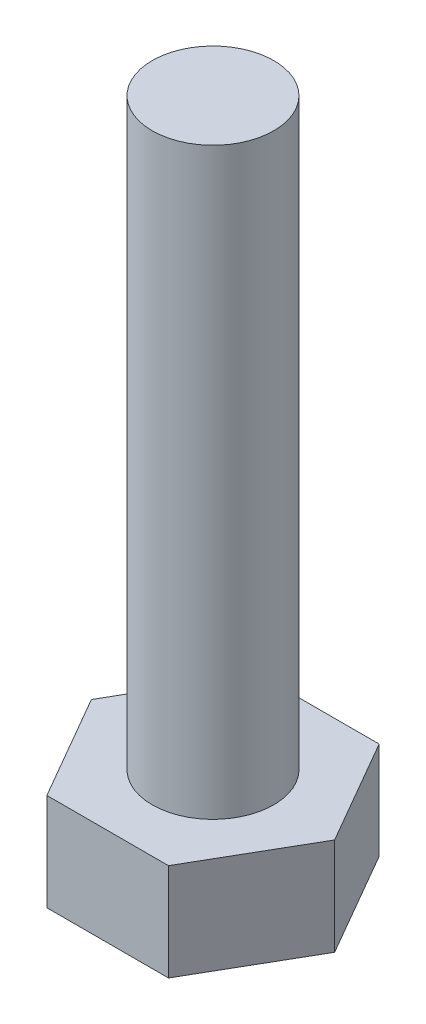
ISO-10303-21;
HEADER;
FILE_DESCRIPTION(('STEP AP214'),'2;1');
FILE_NAME('part.step','',(''),(''),'','','');
FILE_SCHEMA(('AUTOMOTIVE_DESIGN { 1 0 10303 214 1 1 1 1 }'));
ENDSEC;
DATA;
#1=APPLICATION_CONTEXT('core data for automotive mechanical design processes');
#2=APPLICATION_PROTOCOL_DEFINITION('international standard','automotive_design',2000,#1);
#3=PRODUCT_CONTEXT('',#1,'mechanical');
#4=PRODUCT('Part','Part','',(#3));
#5=PRODUCT_RELATED_PRODUCT_CATEGORY('part','',(#4));
#6=PRODUCT_DEFINITION_FORMATION('','',#4);
#7=PRODUCT_DEFINITION_CONTEXT('part definition',#1,'design');
#8=PRODUCT_DEFINITION('design','',#6,#7);
#9=PRODUCT_DEFINITION_SHAPE('','',#8);
#10=(LENGTH_UNIT() NAMED_UNIT(*) SI_UNIT(.MILLI.,.METRE.));
#11=(NAMED_UNIT(*) PLANE_ANGLE_UNIT() SI_UNIT($,.RADIAN.));
#12=(NAMED_UNIT(*) SI_UNIT($,.STERADIAN.) SOLID_ANGLE_UNIT());
#13=UNCERTAINTY_MEASURE_WITH_UNIT(LENGTH_MEASURE(1.E-05),#10,'distance_accuracy_value','');
#14=(GEOMETRIC_REPRESENTATION_CONTEXT(3) GLOBAL_UNCERTAINTY_ASSIGNED_CONTEXT((#13)) GLOBAL_UNIT_ASSIGNED_CONTEXT((#10,
#11,#12)) REPRESENTATION_CONTEXT('',''));
#15=CARTESIAN_POINT('',(0.,0.,0.));
#16=DIRECTION('',(0.,0.,1.));
#17=DIRECTION('',(1.,0.,0.));
#18=AXIS2_PLACEMENT_3D('',#15,#16,#17);
#19=CARTESIAN_POINT('',(1.25,2.,2.1650635094611));
#20=DIRECTION('',(-0.866025403784439,0.,-0.499999999999999));
#21=DIRECTION('',(-0.499999999999999,0.,0.866025403784439));
#22=AXIS2_PLACEMENT_3D('',#19,#20,#21);
#23=PLANE('',#22);
#24=DIRECTION('',(0.499999999999999,0.,-0.866025403784439));
#25=VECTOR('',#24,1.);
#26=CARTESIAN_POINT('',(1.25,0.,2.1650635094611));
#27=LINE('',#26,#25);
#28=CARTESIAN_POINT('',(1.25,0.,2.1650635094611));
#29=VERTEX_POINT('',#28);
#30=CARTESIAN_POINT('',(2.5,0.,0.));
#31=VERTEX_POINT('',#30);
#32=EDGE_CURVE('E134',#29,#31,#27,.T.);
#33=ORIENTED_EDGE('',*,*,#32,.T.);
#34=DIRECTION('',(0.,-1.,0.));
#35=VECTOR('',#34,1.);
#36=CARTESIAN_POINT('',(2.5,2.,0.));
#37=LINE('',#36,#35);
#38=CARTESIAN_POINT('',(2.5,2.,0.));
#39=VERTEX_POINT('',#38);
#40=EDGE_CURVE('E46',#39,#31,#37,.T.);
#41=ORIENTED_EDGE('',*,*,#40,.F.);
#42=DIRECTION('',(0.499999999999999,0.,-0.866025403784439));
#43=VECTOR('',#42,1.);
#44=CARTESIAN_POINT('',(1.25,2.,2.1650635094611));
#45=LINE('',#44,#43);
#46=CARTESIAN_POINT('',(1.25,2.,2.1650635094611));
#47=VERTEX_POINT('',#46);
#48=EDGE_CURVE('E151',#47,#39,#45,.T.);
#49=ORIENTED_EDGE('',*,*,#48,.F.);
#50=DIRECTION('',(0.,-1.,0.));
#51=VECTOR('',#50,1.);
#52=CARTESIAN_POINT('',(1.25,2.,2.1650635094611));
#53=LINE('',#52,#51);
#54=EDGE_CURVE('E130',#47,#29,#53,.T.);
#55=ORIENTED_EDGE('',*,*,#54,.T.);
#56=EDGE_LOOP('',(#33,#41,#49,#55));
#57=FACE_BOUND('',#56,.T.);
#58=ADVANCED_FACE('F43',(#57),#23,.F.);
#59=CARTESIAN_POINT('',(2.5,2.,0.));
#60=DIRECTION('',(-0.866025403784439,0.,0.5));
#61=DIRECTION('',(0.5,0.,0.866025403784439));
#62=AXIS2_PLACEMENT_3D('',#59,#60,#61);
#63=PLANE('',#62);
#64=DIRECTION('',(-0.5,0.,-0.866025403784439));
#65=VECTOR('',#64,1.);
#66=CARTESIAN_POINT('',(2.5,0.,0.));
#67=LINE('',#66,#65);
#68=CARTESIAN_POINT('',(1.25,0.,-2.1650635094611));
#69=VERTEX_POINT('',#68);
#70=EDGE_CURVE('E138',#31,#69,#67,.T.);
#71=ORIENTED_EDGE('',*,*,#70,.T.);
#72=DIRECTION('',(0.,-1.,0.));
#73=VECTOR('',#72,1.);
#74=CARTESIAN_POINT('',(1.25,2.,-2.1650635094611));
#75=LINE('',#74,#73);
#76=CARTESIAN_POINT('',(1.25,2.,-2.1650635094611));
#77=VERTEX_POINT('',#76);
#78=EDGE_CURVE('E157',#77,#69,#75,.T.);
#79=ORIENTED_EDGE('',*,*,#78,.F.);
#80=DIRECTION('',(-0.5,0.,-0.866025403784439));
#81=VECTOR('',#80,1.);
#82=CARTESIAN_POINT('',(2.5,2.,0.));
#83=LINE('',#82,#81);
#84=EDGE_CURVE('E99',#39,#77,#83,.T.);
#85=ORIENTED_EDGE('',*,*,#84,.F.);
#86=ORIENTED_EDGE('',*,*,#40,.T.);
#87=EDGE_LOOP('',(#71,#79,#85,#86));
#88=FACE_BOUND('',#87,.T.);
#89=ADVANCED_FACE('F164',(#88),#63,.F.);
#90=CARTESIAN_POINT('',(1.25,2.,-2.1650635094611));
#91=DIRECTION('',(0.,0.,1.));
#92=DIRECTION('',(1.,0.,0.));
#93=AXIS2_PLACEMENT_3D('',#90,#91,#92);
#94=PLANE('',#93);
#95=DIRECTION('',(-1.,0.,0.));
#96=VECTOR('',#95,1.);
#97=CARTESIAN_POINT('',(1.25,0.,-2.1650635094611));
#98=LINE('',#97,#96);
#99=CARTESIAN_POINT('',(-1.25,0.,-2.1650635094611));
#100=VERTEX_POINT('',#99);
#101=EDGE_CURVE('E142',#69,#100,#98,.T.);
#102=ORIENTED_EDGE('',*,*,#101,.T.);
#103=DIRECTION('',(0.,-1.,0.));
#104=VECTOR('',#103,1.);
#105=CARTESIAN_POINT('',(-1.25,2.,-2.1650635094611));
#106=LINE('',#105,#104);
#107=CARTESIAN_POINT('',(-1.25,2.,-2.1650635094611));
#108=VERTEX_POINT('',#107);
#109=EDGE_CURVE('E123',#108,#100,#106,.T.);
#110=ORIENTED_EDGE('',*,*,#109,.F.);
#111=DIRECTION('',(-1.,0.,0.));
#112=VECTOR('',#111,1.);
#113=CARTESIAN_POINT('',(1.25,2.,-2.1650635094611));
#114=LINE('',#113,#112);
#115=EDGE_CURVE('E112',#77,#108,#114,.T.);
#116=ORIENTED_EDGE('',*,*,#115,.F.);
#117=ORIENTED_EDGE('',*,*,#78,.T.);
#118=EDGE_LOOP('',(#102,#110,#116,#117));
#119=FACE_BOUND('',#118,.T.);
#120=ADVANCED_FACE('F170',(#119),#94,.F.);
#121=CARTESIAN_POINT('',(-1.25,2.,-2.1650635094611));
#122=DIRECTION('',(0.866025403784439,0.,0.499999999999999));
#123=DIRECTION('',(0.5,0.,-0.866025403784439));
#124=AXIS2_PLACEMENT_3D('',#121,#122,#123);
#125=PLANE('',#124);
#126=DIRECTION('',(-0.499999999999999,0.,0.866025403784439));
#127=VECTOR('',#126,1.);
#128=CARTESIAN_POINT('',(-1.25,0.,-2.1650635094611));
#129=LINE('',#128,#127);
#130=CARTESIAN_POINT('',(-2.5,0.,0.));
#131=VERTEX_POINT('',#130);
#132=EDGE_CURVE('E121',#100,#131,#129,.T.);
#133=ORIENTED_EDGE('',*,*,#132,.T.);
#134=DIRECTION('',(0.,-1.,0.));
#135=VECTOR('',#134,1.);
#136=CARTESIAN_POINT('',(-2.5,2.,0.));
#137=LINE('',#136,#135);
#138=CARTESIAN_POINT('',(-2.5,2.,0.));
#139=VERTEX_POINT('',#138);
#140=EDGE_CURVE('E118',#139,#131,#137,.T.);
#141=ORIENTED_EDGE('',*,*,#140,.F.);
#142=DIRECTION('',(-0.499999999999999,0.,0.866025403784439));
#143=VECTOR('',#142,1.);
#144=CARTESIAN_POINT('',(-1.25,2.,-2.1650635094611));
#145=LINE('',#144,#143);
#146=EDGE_CURVE('E106',#108,#139,#145,.T.);
#147=ORIENTED_EDGE('',*,*,#146,.F.);
#148=ORIENTED_EDGE('',*,*,#109,.T.);
#149=EDGE_LOOP('',(#133,#141,#147,#148));
#150=FACE_BOUND('',#149,.T.);
#151=ADVANCED_FACE('F119',(#150),#125,.F.);
#152=CARTESIAN_POINT('',(-2.5,2.,0.));
#153=DIRECTION('',(0.866025403784438,0.,-0.5));
#154=DIRECTION('',(-0.5,0.,-0.866025403784438));
#155=AXIS2_PLACEMENT_3D('',#152,#153,#154);
#156=PLANE('',#155);
#157=DIRECTION('',(0.5,0.,0.866025403784438));
#158=VECTOR('',#157,1.);
#159=CARTESIAN_POINT('',(-2.5,0.,0.));
#160=LINE('',#159,#158);
#161=CARTESIAN_POINT('',(-1.25,0.,2.1650635094611));
#162=VERTEX_POINT('',#161);
#163=EDGE_CURVE('E84',#131,#162,#160,.T.);
#164=ORIENTED_EDGE('',*,*,#163,.T.);
#165=DIRECTION('',(0.,-1.,0.));
#166=VECTOR('',#165,1.);
#167=CARTESIAN_POINT('',(-1.25,2.,2.1650635094611));
#168=LINE('',#167,#166);
#169=CARTESIAN_POINT('',(-1.25,2.,2.1650635094611));
#170=VERTEX_POINT('',#169);
#171=EDGE_CURVE('E124',#170,#162,#168,.T.);
#172=ORIENTED_EDGE('',*,*,#171,.F.);
#173=DIRECTION('',(0.5,0.,0.866025403784438));
#174=VECTOR('',#173,1.);
#175=CARTESIAN_POINT('',(-2.5,2.,0.));
#176=LINE('',#175,#174);
#177=EDGE_CURVE('E110',#139,#170,#176,.T.);
#178=ORIENTED_EDGE('',*,*,#177,.F.);
#179=ORIENTED_EDGE('',*,*,#140,.T.);
#180=EDGE_LOOP('',(#164,#172,#178,#179));
#181=FACE_BOUND('',#180,.T.);
#182=ADVANCED_FACE('F126',(#181),#156,.F.);
#183=CARTESIAN_POINT('',(-1.25,2.,2.1650635094611));
#184=DIRECTION('',(0.,0.,-1.));
#185=DIRECTION('',(-1.,0.,0.));
#186=AXIS2_PLACEMENT_3D('',#183,#184,#185);
#187=PLANE('',#186);
#188=DIRECTION('',(1.,0.,0.));
#189=VECTOR('',#188,1.);
#190=CARTESIAN_POINT('',(-1.25,0.,2.1650635094611));
#191=LINE('',#190,#189);
#192=EDGE_CURVE('E90',#162,#29,#191,.T.);
#193=ORIENTED_EDGE('',*,*,#192,.T.);
#194=ORIENTED_EDGE('',*,*,#54,.F.);
#195=DIRECTION('',(1.,0.,0.));
#196=VECTOR('',#195,1.);
#197=CARTESIAN_POINT('',(-1.25,2.,2.1650635094611));
#198=LINE('',#197,#196);
#199=EDGE_CURVE('E61',#170,#47,#198,.T.);
#200=ORIENTED_EDGE('',*,*,#199,.F.);
#201=ORIENTED_EDGE('',*,*,#171,.T.);
#202=EDGE_LOOP('',(#193,#194,#200,#201));
#203=FACE_BOUND('',#202,.T.);
#204=ADVANCED_FACE('F190',(#203),#187,.F.);
#205=CARTESIAN_POINT('',(0.,2.,0.));
#206=DIRECTION('',(0.,1.,0.));
#207=DIRECTION('',(0.,0.,1.));
#208=AXIS2_PLACEMENT_3D('',#205,#206,#207);
#209=PLANE('',#208);
#210=CARTESIAN_POINT('',(0.,2.,0.));
#211=DIRECTION('',(0.,1.,0.));
#212=DIRECTION('',(0.,0.,1.));
#213=AXIS2_PLACEMENT_3D('',#210,#211,#212);
#214=CIRCLE('',#213,1.25);
#215=CARTESIAN_POINT('',(0.,2.,1.25));
#216=VERTEX_POINT('',#215);
#217=EDGE_CURVE('E11',#216,#216,#214,.T.);
#218=ORIENTED_EDGE('',*,*,#217,.F.);
#219=EDGE_LOOP('',(#218));
#220=FACE_BOUND('',#219,.T.);
#221=ORIENTED_EDGE('',*,*,#48,.T.);
#222=ORIENTED_EDGE('',*,*,#84,.T.);
#223=ORIENTED_EDGE('',*,*,#115,.T.);
#224=ORIENTED_EDGE('',*,*,#146,.T.);
#225=ORIENTED_EDGE('',*,*,#177,.T.);
#226=ORIENTED_EDGE('',*,*,#199,.T.);
#227=EDGE_LOOP('',(#221,#222,#223,#224,#225,#226));
#228=FACE_BOUND('',#227,.T.);
#229=ADVANCED_FACE('F108',(#220,#228),#209,.T.);
#230=CARTESIAN_POINT('',(0.,0.,0.));
#231=DIRECTION('',(0.,1.,0.));
#232=DIRECTION('',(0.,0.,1.));
#233=AXIS2_PLACEMENT_3D('',#230,#231,#232);
#234=PLANE('',#233);
#235=ORIENTED_EDGE('',*,*,#32,.F.);
#236=ORIENTED_EDGE('',*,*,#192,.F.);
#237=ORIENTED_EDGE('',*,*,#163,.F.);
#238=ORIENTED_EDGE('',*,*,#132,.F.);
#239=ORIENTED_EDGE('',*,*,#101,.F.);
#240=ORIENTED_EDGE('',*,*,#70,.F.);
#241=EDGE_LOOP('',(#235,#236,#237,#238,#239,#240));
#242=FACE_BOUND('',#241,.T.);
#243=ADVANCED_FACE('F169',(#242),#234,.F.);
#244=CARTESIAN_POINT('',(0.,14.,0.));
#245=DIRECTION('',(0.,-1.,0.));
#246=DIRECTION('',(0.,0.,-1.));
#247=AXIS2_PLACEMENT_3D('',#244,#245,#246);
#248=CYLINDRICAL_SURFACE('',#247,1.25);
#249=CARTESIAN_POINT('',(0.,14.,0.));
#250=DIRECTION('',(0.,1.,0.));
#251=DIRECTION('',(0.,0.,1.));
#252=AXIS2_PLACEMENT_3D('',#249,#250,#251);
#253=CIRCLE('',#252,1.25);
#254=CARTESIAN_POINT('',(0.,14.,1.25));
#255=VERTEX_POINT('',#254);
#256=EDGE_CURVE('E139',#255,#255,#253,.T.);
#257=ORIENTED_EDGE('',*,*,#256,.F.);
#258=EDGE_LOOP('',(#257));
#259=FACE_BOUND('',#258,.T.);
#260=ORIENTED_EDGE('',*,*,#217,.T.);
#261=EDGE_LOOP('',(#260));
#262=FACE_BOUND('',#261,.T.);
#263=ADVANCED_FACE('F183',(#259,#262),#248,.T.);
#264=CARTESIAN_POINT('',(0.,14.,0.));
#265=DIRECTION('',(0.,1.,0.));
#266=DIRECTION('',(0.,0.,1.));
#267=AXIS2_PLACEMENT_3D('',#264,#265,#266);
#268=PLANE('',#267);
#269=ORIENTED_EDGE('',*,*,#256,.T.);
#270=EDGE_LOOP('',(#269));
#271=FACE_BOUND('',#270,.T.);
#272=ADVANCED_FACE('F181',(#271),#268,.T.);
#273=CLOSED_SHELL('',(#58,#89,#120,#151,#182,#204,#229,#243,#263,#272));
#274=MANIFOLD_SOLID_BREP('B2',#273);
#275=ADVANCED_BREP_SHAPE_REPRESENTATION('',(#18,#274),#14);
#276=SHAPE_DEFINITION_REPRESENTATION(#9,#275);
ENDSEC;
END-ISO-10303-21;
